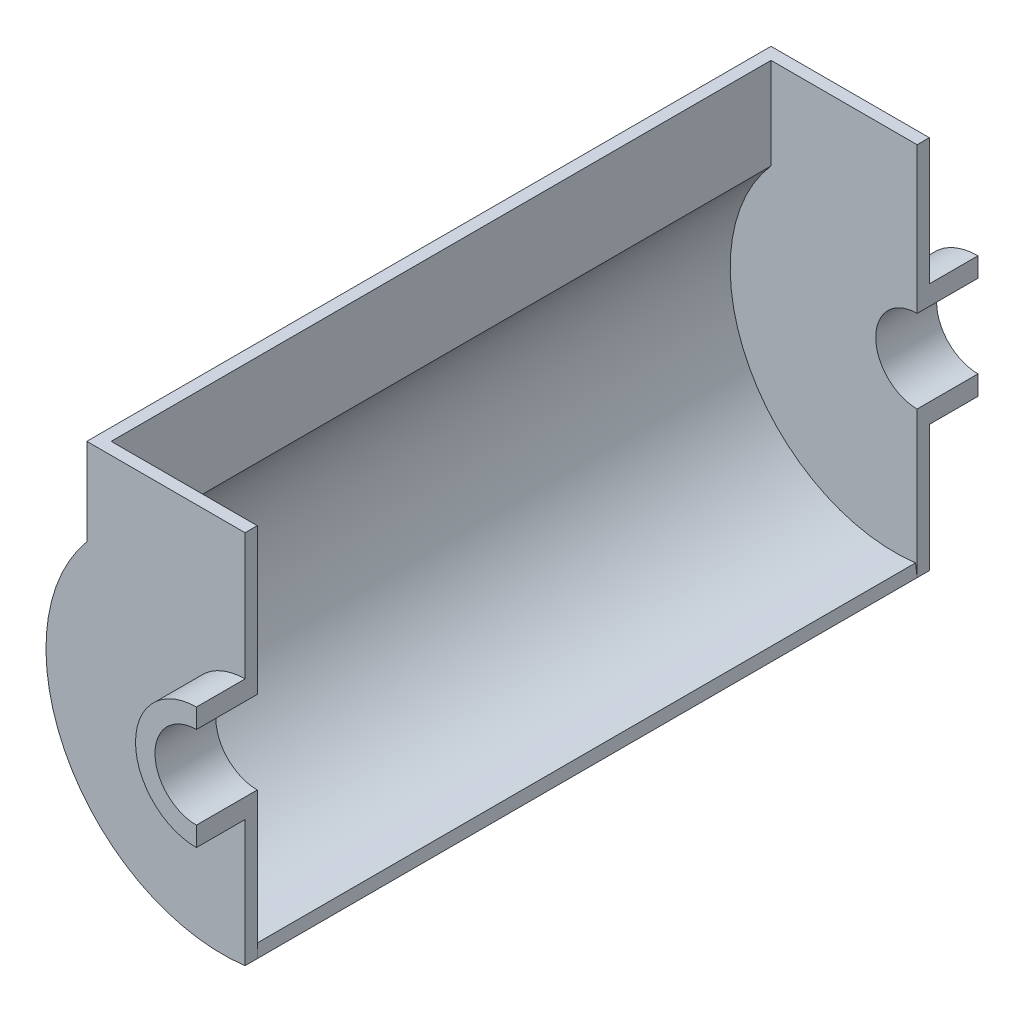
ISO-10303-21;
HEADER;
FILE_DESCRIPTION(('STEP AP214'),'2;1');
FILE_NAME('part.step','',(''),(''),'','','');
FILE_SCHEMA(('AUTOMOTIVE_DESIGN { 1 0 10303 214 1 1 1 1 }'));
ENDSEC;
DATA;
#1=APPLICATION_CONTEXT('core data for automotive mechanical design processes');
#2=APPLICATION_PROTOCOL_DEFINITION('international standard','automotive_design',2000,#1);
#3=PRODUCT_CONTEXT('',#1,'mechanical');
#4=PRODUCT('Part','Part','',(#3));
#5=PRODUCT_RELATED_PRODUCT_CATEGORY('part','',(#4));
#6=PRODUCT_DEFINITION_FORMATION('','',#4);
#7=PRODUCT_DEFINITION_CONTEXT('part definition',#1,'design');
#8=PRODUCT_DEFINITION('design','',#6,#7);
#9=PRODUCT_DEFINITION_SHAPE('','',#8);
#10=(LENGTH_UNIT() NAMED_UNIT(*) SI_UNIT(.MILLI.,.METRE.));
#11=(NAMED_UNIT(*) PLANE_ANGLE_UNIT() SI_UNIT($,.RADIAN.));
#12=(NAMED_UNIT(*) SI_UNIT($,.STERADIAN.) SOLID_ANGLE_UNIT());
#13=UNCERTAINTY_MEASURE_WITH_UNIT(LENGTH_MEASURE(1.E-05),#10,'distance_accuracy_value','');
#14=(GEOMETRIC_REPRESENTATION_CONTEXT(3) GLOBAL_UNCERTAINTY_ASSIGNED_CONTEXT((#13)) GLOBAL_UNIT_ASSIGNED_CONTEXT((#10,
#11,#12)) REPRESENTATION_CONTEXT('',''));
#15=CARTESIAN_POINT('',(0.,0.,0.));
#16=DIRECTION('',(0.,0.,1.));
#17=DIRECTION('',(1.,0.,0.));
#18=AXIS2_PLACEMENT_3D('',#15,#16,#17);
#19=CARTESIAN_POINT('',(0.,0.,-5.));
#20=DIRECTION('',(0.,0.,1.));
#21=DIRECTION('',(1.,0.,0.));
#22=AXIS2_PLACEMENT_3D('',#19,#20,#21);
#23=PLANE('',#22);
#24=DIRECTION('',(0.127888141003739,-0.99178859813501,0.));
#25=VECTOR('',#24,1.);
#26=CARTESIAN_POINT('',(0.,-77.,-5.));
#27=LINE('',#26,#25);
#28=CARTESIAN_POINT('',(-0.639440705018703,-72.0410570093249,-5.));
#29=VERTEX_POINT('',#28);
#30=CARTESIAN_POINT('',(0.,-77.,-5.));
#31=VERTEX_POINT('',#30);
#32=EDGE_CURVE('E61',#29,#31,#27,.T.);
#33=ORIENTED_EDGE('',*,*,#32,.F.);
#34=CARTESIAN_POINT('',(-9.2718902227714,-5.09532663521184,-5.));
#35=DIRECTION('',(0.,0.,1.));
#36=DIRECTION('',(-1.,0.,0.));
#37=AXIS2_PLACEMENT_3D('',#34,#35,#36);
#38=CIRCLE('',#37,67.5);
#39=CARTESIAN_POINT('',(-60.,39.4345383817567,-5.));
#40=VERTEX_POINT('',#39);
#41=EDGE_CURVE('E225',#40,#29,#38,.T.);
#42=ORIENTED_EDGE('',*,*,#41,.F.);
#43=DIRECTION('',(0.,-1.,0.));
#44=VECTOR('',#43,1.);
#45=CARTESIAN_POINT('',(-60.,77.,-5.));
#46=LINE('',#45,#44);
#47=CARTESIAN_POINT('',(-60.,77.,-5.));
#48=VERTEX_POINT('',#47);
#49=EDGE_CURVE('E67',#48,#40,#46,.T.);
#50=ORIENTED_EDGE('',*,*,#49,.F.);
#51=DIRECTION('',(-1.,0.,0.));
#52=VECTOR('',#51,1.);
#53=CARTESIAN_POINT('',(0.,77.,-5.));
#54=LINE('',#53,#52);
#55=CARTESIAN_POINT('',(0.,77.,-5.));
#56=VERTEX_POINT('',#55);
#57=EDGE_CURVE('E252',#56,#48,#54,.T.);
#58=ORIENTED_EDGE('',*,*,#57,.F.);
#59=DIRECTION('',(0.,1.,0.));
#60=VECTOR('',#59,1.);
#61=CARTESIAN_POINT('',(0.,17.,-5.));
#62=LINE('',#61,#60);
#63=CARTESIAN_POINT('',(0.,17.,-5.));
#64=VERTEX_POINT('',#63);
#65=EDGE_CURVE('E310',#64,#56,#62,.T.);
#66=ORIENTED_EDGE('',*,*,#65,.F.);
#67=CARTESIAN_POINT('',(0.,0.,-5.));
#68=DIRECTION('',(0.,0.,-1.));
#69=DIRECTION('',(1.,0.,0.));
#70=AXIS2_PLACEMENT_3D('',#67,#68,#69);
#71=CIRCLE('',#70,17.);
#72=CARTESIAN_POINT('',(0.,-17.,-5.));
#73=VERTEX_POINT('',#72);
#74=EDGE_CURVE('E306',#73,#64,#71,.T.);
#75=ORIENTED_EDGE('',*,*,#74,.F.);
#76=DIRECTION('',(0.,1.,0.));
#77=VECTOR('',#76,1.);
#78=CARTESIAN_POINT('',(0.,-25.,-5.));
#79=LINE('',#78,#77);
#80=EDGE_CURVE('E313',#31,#73,#79,.T.);
#81=ORIENTED_EDGE('',*,*,#80,.F.);
#82=EDGE_LOOP('',(#33,#42,#50,#58,#66,#75,#81));
#83=FACE_BOUND('',#82,.T.);
#84=ADVANCED_FACE('F43',(#83),#23,.F.);
#85=CARTESIAN_POINT('',(0.,0.,-5.));
#86=DIRECTION('',(0.,0.,1.));
#87=DIRECTION('',(1.,0.,0.));
#88=AXIS2_PLACEMENT_3D('',#85,#86,#87);
#89=CYLINDRICAL_SURFACE('',#88,17.);
#90=DIRECTION('',(0.,0.,1.));
#91=VECTOR('',#90,1.);
#92=CARTESIAN_POINT('',(0.,17.,-5.));
#93=LINE('',#92,#91);
#94=CARTESIAN_POINT('',(0.,17.,20.));
#95=VERTEX_POINT('',#94);
#96=EDGE_CURVE('E47',#64,#95,#93,.T.);
#97=ORIENTED_EDGE('',*,*,#96,.T.);
#98=CARTESIAN_POINT('',(0.,0.,20.));
#99=DIRECTION('',(0.,0.,-1.));
#100=DIRECTION('',(1.,0.,0.));
#101=AXIS2_PLACEMENT_3D('',#98,#99,#100);
#102=CIRCLE('',#101,17.);
#103=CARTESIAN_POINT('',(0.,-17.,20.));
#104=VERTEX_POINT('',#103);
#105=EDGE_CURVE('E282',#104,#95,#102,.T.);
#106=ORIENTED_EDGE('',*,*,#105,.F.);
#107=DIRECTION('',(0.,0.,1.));
#108=VECTOR('',#107,1.);
#109=CARTESIAN_POINT('',(0.,-17.,-5.));
#110=LINE('',#109,#108);
#111=EDGE_CURVE('E11',#73,#104,#110,.T.);
#112=ORIENTED_EDGE('',*,*,#111,.F.);
#113=ORIENTED_EDGE('',*,*,#74,.T.);
#114=EDGE_LOOP('',(#97,#106,#112,#113));
#115=FACE_BOUND('',#114,.T.);
#116=ADVANCED_FACE('F45',(#115),#89,.F.);
#117=CARTESIAN_POINT('',(0.,-25.,-5.));
#118=DIRECTION('',(1.,0.,0.));
#119=DIRECTION('',(0.,0.,-1.));
#120=AXIS2_PLACEMENT_3D('',#117,#118,#119);
#121=PLANE('',#120);
#122=ORIENTED_EDGE('',*,*,#111,.T.);
#123=DIRECTION('',(0.,1.,0.));
#124=VECTOR('',#123,1.);
#125=CARTESIAN_POINT('',(0.,-25.,20.));
#126=LINE('',#125,#124);
#127=CARTESIAN_POINT('',(0.,-25.,20.));
#128=VERTEX_POINT('',#127);
#129=EDGE_CURVE('E302',#128,#104,#126,.T.);
#130=ORIENTED_EDGE('',*,*,#129,.F.);
#131=DIRECTION('',(0.,0.,1.));
#132=VECTOR('',#131,1.);
#133=CARTESIAN_POINT('',(0.,-25.,-5.));
#134=LINE('',#133,#132);
#135=CARTESIAN_POINT('',(0.,-25.,0.));
#136=VERTEX_POINT('',#135);
#137=EDGE_CURVE('E53',#136,#128,#134,.T.);
#138=ORIENTED_EDGE('',*,*,#137,.F.);
#139=DIRECTION('',(0.,1.,0.));
#140=VECTOR('',#139,1.);
#141=CARTESIAN_POINT('',(0.,-25.,0.));
#142=LINE('',#141,#140);
#143=CARTESIAN_POINT('',(0.,-77.,0.));
#144=VERTEX_POINT('',#143);
#145=EDGE_CURVE('E256',#144,#136,#142,.T.);
#146=ORIENTED_EDGE('',*,*,#145,.F.);
#147=DIRECTION('',(0.,0.,1.));
#148=VECTOR('',#147,1.);
#149=CARTESIAN_POINT('',(0.,-77.,-5.));
#150=LINE('',#149,#148);
#151=EDGE_CURVE('E279',#31,#144,#150,.T.);
#152=ORIENTED_EDGE('',*,*,#151,.F.);
#153=ORIENTED_EDGE('',*,*,#80,.T.);
#154=EDGE_LOOP('',(#122,#130,#138,#146,#152,#153));
#155=FACE_BOUND('',#154,.T.);
#156=ADVANCED_FACE('F335',(#155),#121,.T.);
#157=CARTESIAN_POINT('',(0.,0.,-5.));
#158=DIRECTION('',(0.,0.,1.));
#159=DIRECTION('',(1.,0.,0.));
#160=AXIS2_PLACEMENT_3D('',#157,#158,#159);
#161=CYLINDRICAL_SURFACE('',#160,25.);
#162=CARTESIAN_POINT('',(0.,0.,0.));
#163=DIRECTION('',(0.,0.,-1.));
#164=DIRECTION('',(1.,0.,0.));
#165=AXIS2_PLACEMENT_3D('',#162,#163,#164);
#166=CIRCLE('',#165,25.);
#167=CARTESIAN_POINT('',(0.,25.,0.));
#168=VERTEX_POINT('',#167);
#169=EDGE_CURVE('E235',#136,#168,#166,.T.);
#170=ORIENTED_EDGE('',*,*,#169,.F.);
#171=ORIENTED_EDGE('',*,*,#137,.T.);
#172=CARTESIAN_POINT('',(0.,0.,20.));
#173=DIRECTION('',(0.,0.,1.));
#174=DIRECTION('',(1.,0.,0.));
#175=AXIS2_PLACEMENT_3D('',#172,#173,#174);
#176=CIRCLE('',#175,25.);
#177=CARTESIAN_POINT('',(0.,25.,20.));
#178=VERTEX_POINT('',#177);
#179=EDGE_CURVE('E298',#178,#128,#176,.T.);
#180=ORIENTED_EDGE('',*,*,#179,.F.);
#181=DIRECTION('',(0.,0.,1.));
#182=VECTOR('',#181,1.);
#183=CARTESIAN_POINT('',(0.,25.,-5.));
#184=LINE('',#183,#182);
#185=EDGE_CURVE('E318',#168,#178,#184,.T.);
#186=ORIENTED_EDGE('',*,*,#185,.F.);
#187=EDGE_LOOP('',(#170,#171,#180,#186));
#188=FACE_BOUND('',#187,.T.);
#189=ADVANCED_FACE('F343',(#188),#161,.T.);
#190=CARTESIAN_POINT('',(0.,17.,-5.));
#191=DIRECTION('',(1.,0.,0.));
#192=DIRECTION('',(0.,0.,-1.));
#193=AXIS2_PLACEMENT_3D('',#190,#191,#192);
#194=PLANE('',#193);
#195=ORIENTED_EDGE('',*,*,#65,.T.);
#196=DIRECTION('',(0.,0.,1.));
#197=VECTOR('',#196,1.);
#198=CARTESIAN_POINT('',(0.,77.,-5.));
#199=LINE('',#198,#197);
#200=CARTESIAN_POINT('',(0.,77.,0.));
#201=VERTEX_POINT('',#200);
#202=EDGE_CURVE('E255',#56,#201,#199,.T.);
#203=ORIENTED_EDGE('',*,*,#202,.T.);
#204=DIRECTION('',(0.,1.,0.));
#205=VECTOR('',#204,1.);
#206=CARTESIAN_POINT('',(0.,25.,0.));
#207=LINE('',#206,#205);
#208=EDGE_CURVE('E260',#168,#201,#207,.T.);
#209=ORIENTED_EDGE('',*,*,#208,.F.);
#210=ORIENTED_EDGE('',*,*,#185,.T.);
#211=DIRECTION('',(0.,1.,0.));
#212=VECTOR('',#211,1.);
#213=CARTESIAN_POINT('',(0.,17.,20.));
#214=LINE('',#213,#212);
#215=EDGE_CURVE('E294',#95,#178,#214,.T.);
#216=ORIENTED_EDGE('',*,*,#215,.F.);
#217=ORIENTED_EDGE('',*,*,#96,.F.);
#218=EDGE_LOOP('',(#195,#203,#209,#210,#216,#217));
#219=FACE_BOUND('',#218,.T.);
#220=ADVANCED_FACE('F328',(#219),#194,.T.);
#221=CARTESIAN_POINT('',(0.,0.,20.));
#222=DIRECTION('',(0.,0.,1.));
#223=DIRECTION('',(1.,0.,0.));
#224=AXIS2_PLACEMENT_3D('',#221,#222,#223);
#225=PLANE('',#224);
#226=ORIENTED_EDGE('',*,*,#105,.T.);
#227=ORIENTED_EDGE('',*,*,#215,.T.);
#228=ORIENTED_EDGE('',*,*,#179,.T.);
#229=ORIENTED_EDGE('',*,*,#129,.T.);
#230=EDGE_LOOP('',(#226,#227,#228,#229));
#231=FACE_BOUND('',#230,.T.);
#232=ADVANCED_FACE('F331',(#231),#225,.T.);
#233=CARTESIAN_POINT('',(-9.2718902227714,-5.09532663521184,-5.));
#234=DIRECTION('',(0.,0.,1.));
#235=DIRECTION('',(1.,0.,0.));
#236=AXIS2_PLACEMENT_3D('',#233,#234,#235);
#237=CYLINDRICAL_SURFACE('',#236,72.5);
#238=CARTESIAN_POINT('',(-9.2718902227714,-5.09532663521184,0.));
#239=DIRECTION('',(0.,0.,1.));
#240=DIRECTION('',(1.,0.,0.));
#241=AXIS2_PLACEMENT_3D('',#238,#239,#240);
#242=CIRCLE('',#241,72.5);
#243=CARTESIAN_POINT('',(-65.,41.2795348811006,0.));
#244=VERTEX_POINT('',#243);
#245=EDGE_CURVE('E272',#244,#144,#242,.T.);
#246=ORIENTED_EDGE('',*,*,#245,.F.);
#247=DIRECTION('',(0.,0.,1.));
#248=VECTOR('',#247,1.);
#249=CARTESIAN_POINT('',(-65.,41.2795348811006,-5.));
#250=LINE('',#249,#248);
#251=CARTESIAN_POINT('',(-65.,41.2795348811006,-281.));
#252=VERTEX_POINT('',#251);
#253=EDGE_CURVE('E283',#252,#244,#250,.T.);
#254=ORIENTED_EDGE('',*,*,#253,.F.);
#255=CARTESIAN_POINT('',(-9.2718902227714,-5.09532663521184,-281.));
#256=DIRECTION('',(0.,0.,1.));
#257=DIRECTION('',(1.,0.,0.));
#258=AXIS2_PLACEMENT_3D('',#255,#256,#257);
#259=CIRCLE('',#258,72.5);
#260=CARTESIAN_POINT('',(0.,-77.,-281.));
#261=VERTEX_POINT('',#260);
#262=EDGE_CURVE('E424',#252,#261,#259,.T.);
#263=ORIENTED_EDGE('',*,*,#262,.T.);
#264=DIRECTION('',(0.,0.,-1.));
#265=VECTOR('',#264,1.);
#266=CARTESIAN_POINT('',(0.,-77.,-276.));
#267=LINE('',#266,#265);
#268=CARTESIAN_POINT('',(0.,-77.,-276.));
#269=VERTEX_POINT('',#268);
#270=EDGE_CURVE('E188',#269,#261,#267,.T.);
#271=ORIENTED_EDGE('',*,*,#270,.F.);
#272=DIRECTION('',(0.,0.,1.));
#273=VECTOR('',#272,1.);
#274=CARTESIAN_POINT('',(0.,-77.,-450.889556715239));
#275=LINE('',#274,#273);
#276=EDGE_CURVE('E210',#269,#31,#275,.T.);
#277=ORIENTED_EDGE('',*,*,#276,.T.);
#278=ORIENTED_EDGE('',*,*,#151,.T.);
#279=EDGE_LOOP('',(#246,#254,#263,#271,#277,#278));
#280=FACE_BOUND('',#279,.T.);
#281=ADVANCED_FACE('F359',(#280),#237,.T.);
#282=CARTESIAN_POINT('',(-65.,77.,-5.));
#283=DIRECTION('',(-1.,0.,0.));
#284=DIRECTION('',(0.,-1.,0.));
#285=AXIS2_PLACEMENT_3D('',#282,#283,#284);
#286=PLANE('',#285);
#287=DIRECTION('',(0.,-1.,0.));
#288=VECTOR('',#287,1.);
#289=CARTESIAN_POINT('',(-65.,77.,0.));
#290=LINE('',#289,#288);
#291=CARTESIAN_POINT('',(-65.,77.,0.));
#292=VERTEX_POINT('',#291);
#293=EDGE_CURVE('E268',#292,#244,#290,.T.);
#294=ORIENTED_EDGE('',*,*,#293,.F.);
#295=DIRECTION('',(0.,0.,1.));
#296=VECTOR('',#295,1.);
#297=CARTESIAN_POINT('',(-65.,77.,-5.));
#298=LINE('',#297,#296);
#299=CARTESIAN_POINT('',(-65.,77.,-281.));
#300=VERTEX_POINT('',#299);
#301=EDGE_CURVE('E286',#300,#292,#298,.T.);
#302=ORIENTED_EDGE('',*,*,#301,.F.);
#303=DIRECTION('',(0.,-1.,0.));
#304=VECTOR('',#303,1.);
#305=CARTESIAN_POINT('',(-65.,77.,-281.));
#306=LINE('',#305,#304);
#307=EDGE_CURVE('E427',#300,#252,#306,.T.);
#308=ORIENTED_EDGE('',*,*,#307,.T.);
#309=ORIENTED_EDGE('',*,*,#253,.T.);
#310=EDGE_LOOP('',(#294,#302,#308,#309));
#311=FACE_BOUND('',#310,.T.);
#312=ADVANCED_FACE('F362',(#311),#286,.T.);
#313=CARTESIAN_POINT('',(0.,77.,-5.));
#314=DIRECTION('',(0.,1.,0.));
#315=DIRECTION('',(-1.,0.,0.));
#316=AXIS2_PLACEMENT_3D('',#313,#314,#315);
#317=PLANE('',#316);
#318=DIRECTION('',(-1.,0.,0.));
#319=VECTOR('',#318,1.);
#320=CARTESIAN_POINT('',(0.,77.,0.));
#321=LINE('',#320,#319);
#322=EDGE_CURVE('E264',#201,#292,#321,.T.);
#323=ORIENTED_EDGE('',*,*,#322,.F.);
#324=ORIENTED_EDGE('',*,*,#202,.F.);
#325=ORIENTED_EDGE('',*,*,#57,.T.);
#326=DIRECTION('',(0.,0.,1.));
#327=VECTOR('',#326,1.);
#328=CARTESIAN_POINT('',(-60.,77.,-450.889556715239));
#329=LINE('',#328,#327);
#330=CARTESIAN_POINT('',(-60.,77.,-276.));
#331=VERTEX_POINT('',#330);
#332=EDGE_CURVE('E173',#331,#48,#329,.T.);
#333=ORIENTED_EDGE('',*,*,#332,.F.);
#334=DIRECTION('',(-1.,0.,0.));
#335=VECTOR('',#334,1.);
#336=CARTESIAN_POINT('',(0.,77.,-276.));
#337=LINE('',#336,#335);
#338=CARTESIAN_POINT('',(0.,77.,-276.));
#339=VERTEX_POINT('',#338);
#340=EDGE_CURVE('E165',#339,#331,#337,.T.);
#341=ORIENTED_EDGE('',*,*,#340,.F.);
#342=DIRECTION('',(0.,0.,-1.));
#343=VECTOR('',#342,1.);
#344=CARTESIAN_POINT('',(0.,77.,-276.));
#345=LINE('',#344,#343);
#346=CARTESIAN_POINT('',(0.,77.,-281.));
#347=VERTEX_POINT('',#346);
#348=EDGE_CURVE('E170',#339,#347,#345,.T.);
#349=ORIENTED_EDGE('',*,*,#348,.T.);
#350=DIRECTION('',(-1.,0.,0.));
#351=VECTOR('',#350,1.);
#352=CARTESIAN_POINT('',(0.,77.,-281.));
#353=LINE('',#352,#351);
#354=EDGE_CURVE('E447',#347,#300,#353,.T.);
#355=ORIENTED_EDGE('',*,*,#354,.T.);
#356=ORIENTED_EDGE('',*,*,#301,.T.);
#357=EDGE_LOOP('',(#323,#324,#325,#333,#341,#349,#355,#356));
#358=FACE_BOUND('',#357,.T.);
#359=ADVANCED_FACE('F168',(#358),#317,.T.);
#360=CARTESIAN_POINT('',(0.,0.,0.));
#361=DIRECTION('',(0.,0.,1.));
#362=DIRECTION('',(1.,0.,0.));
#363=AXIS2_PLACEMENT_3D('',#360,#361,#362);
#364=PLANE('',#363);
#365=ORIENTED_EDGE('',*,*,#169,.T.);
#366=ORIENTED_EDGE('',*,*,#208,.T.);
#367=ORIENTED_EDGE('',*,*,#322,.T.);
#368=ORIENTED_EDGE('',*,*,#293,.T.);
#369=ORIENTED_EDGE('',*,*,#245,.T.);
#370=ORIENTED_EDGE('',*,*,#145,.T.);
#371=EDGE_LOOP('',(#365,#366,#367,#368,#369,#370));
#372=FACE_BOUND('',#371,.T.);
#373=ADVANCED_FACE('F341',(#372),#364,.T.);
#374=CARTESIAN_POINT('',(-60.,77.,-450.889556715239));
#375=DIRECTION('',(-1.,0.,0.));
#376=DIRECTION('',(0.,-1.,0.));
#377=AXIS2_PLACEMENT_3D('',#374,#375,#376);
#378=PLANE('',#377);
#379=DIRECTION('',(0.,-1.,0.));
#380=VECTOR('',#379,1.);
#381=CARTESIAN_POINT('',(-60.,77.,-276.));
#382=LINE('',#381,#380);
#383=CARTESIAN_POINT('',(-60.,39.4345383817567,-276.));
#384=VERTEX_POINT('',#383);
#385=EDGE_CURVE('E236',#331,#384,#382,.T.);
#386=ORIENTED_EDGE('',*,*,#385,.F.);
#387=ORIENTED_EDGE('',*,*,#332,.T.);
#388=ORIENTED_EDGE('',*,*,#49,.T.);
#389=DIRECTION('',(0.,0.,1.));
#390=VECTOR('',#389,1.);
#391=CARTESIAN_POINT('',(-60.,39.4345383817567,-450.889556715239));
#392=LINE('',#391,#390);
#393=EDGE_CURVE('E229',#384,#40,#392,.T.);
#394=ORIENTED_EDGE('',*,*,#393,.F.);
#395=EDGE_LOOP('',(#386,#387,#388,#394));
#396=FACE_BOUND('',#395,.T.);
#397=ADVANCED_FACE('F371',(#396),#378,.F.);
#398=CARTESIAN_POINT('',(-9.2718902227714,-5.09532663521184,-450.889556715239));
#399=DIRECTION('',(0.,0.,1.));
#400=DIRECTION('',(1.,0.,0.));
#401=AXIS2_PLACEMENT_3D('',#398,#399,#400);
#402=CYLINDRICAL_SURFACE('',#401,67.5);
#403=CARTESIAN_POINT('',(-9.2718902227714,-5.09532663521184,-276.));
#404=DIRECTION('',(0.,0.,-1.));
#405=DIRECTION('',(-1.,0.,0.));
#406=AXIS2_PLACEMENT_3D('',#403,#404,#405);
#407=CIRCLE('',#406,67.5);
#408=CARTESIAN_POINT('',(-0.639440705018703,-72.0410570093249,-276.));
#409=VERTEX_POINT('',#408);
#410=EDGE_CURVE('E232',#384,#409,#407,.F.);
#411=ORIENTED_EDGE('',*,*,#410,.F.);
#412=ORIENTED_EDGE('',*,*,#393,.T.);
#413=ORIENTED_EDGE('',*,*,#41,.T.);
#414=DIRECTION('',(0.,0.,1.));
#415=VECTOR('',#414,1.);
#416=CARTESIAN_POINT('',(-0.639440705018703,-72.0410570093249,-450.889556715239));
#417=LINE('',#416,#415);
#418=EDGE_CURVE('E224',#409,#29,#417,.T.);
#419=ORIENTED_EDGE('',*,*,#418,.F.);
#420=EDGE_LOOP('',(#411,#412,#413,#419));
#421=FACE_BOUND('',#420,.T.);
#422=ADVANCED_FACE('F374',(#421),#402,.F.);
#423=CARTESIAN_POINT('',(0.,-77.,-450.889556715239));
#424=DIRECTION('',(-0.99178859813501,-0.127888141003739,0.));
#425=DIRECTION('',(0.127888141003739,-0.99178859813501,0.));
#426=AXIS2_PLACEMENT_3D('',#423,#424,#425);
#427=PLANE('',#426);
#428=DIRECTION('',(0.127888141003739,-0.99178859813501,0.));
#429=VECTOR('',#428,1.);
#430=CARTESIAN_POINT('',(0.,-77.,-276.));
#431=LINE('',#430,#429);
#432=EDGE_CURVE('E223',#409,#269,#431,.T.);
#433=ORIENTED_EDGE('',*,*,#432,.F.);
#434=ORIENTED_EDGE('',*,*,#418,.T.);
#435=ORIENTED_EDGE('',*,*,#32,.T.);
#436=ORIENTED_EDGE('',*,*,#276,.F.);
#437=EDGE_LOOP('',(#433,#434,#435,#436));
#438=FACE_BOUND('',#437,.T.);
#439=ADVANCED_FACE('F378',(#438),#427,.F.);
#440=CARTESIAN_POINT('',(0.,0.,-276.));
#441=DIRECTION('',(0.,0.,-1.));
#442=DIRECTION('',(1.,0.,0.));
#443=AXIS2_PLACEMENT_3D('',#440,#441,#442);
#444=PLANE('',#443);
#445=ORIENTED_EDGE('',*,*,#410,.T.);
#446=ORIENTED_EDGE('',*,*,#432,.T.);
#447=DIRECTION('',(0.,1.,0.));
#448=VECTOR('',#447,1.);
#449=CARTESIAN_POINT('',(0.,-25.,-276.));
#450=LINE('',#449,#448);
#451=CARTESIAN_POINT('',(0.,-17.,-276.));
#452=VERTEX_POINT('',#451);
#453=EDGE_CURVE('E196',#269,#452,#450,.T.);
#454=ORIENTED_EDGE('',*,*,#453,.T.);
#455=CARTESIAN_POINT('',(0.,0.,-276.));
#456=DIRECTION('',(0.,0.,-1.));
#457=DIRECTION('',(1.,0.,0.));
#458=AXIS2_PLACEMENT_3D('',#455,#456,#457);
#459=CIRCLE('',#458,17.);
#460=CARTESIAN_POINT('',(0.,17.,-276.));
#461=VERTEX_POINT('',#460);
#462=EDGE_CURVE('E193',#452,#461,#459,.T.);
#463=ORIENTED_EDGE('',*,*,#462,.T.);
#464=DIRECTION('',(0.,1.,0.));
#465=VECTOR('',#464,1.);
#466=CARTESIAN_POINT('',(0.,17.,-276.));
#467=LINE('',#466,#465);
#468=EDGE_CURVE('E183',#461,#339,#467,.T.);
#469=ORIENTED_EDGE('',*,*,#468,.T.);
#470=ORIENTED_EDGE('',*,*,#340,.T.);
#471=ORIENTED_EDGE('',*,*,#385,.T.);
#472=EDGE_LOOP('',(#445,#446,#454,#463,#469,#470,#471));
#473=FACE_BOUND('',#472,.T.);
#474=ADVANCED_FACE('F191',(#473),#444,.F.);
#475=CARTESIAN_POINT('',(0.,0.,-276.));
#476=DIRECTION('',(0.,0.,-1.));
#477=DIRECTION('',(1.,0.,0.));
#478=AXIS2_PLACEMENT_3D('',#475,#476,#477);
#479=CYLINDRICAL_SURFACE('',#478,17.);
#480=DIRECTION('',(0.,0.,-1.));
#481=VECTOR('',#480,1.);
#482=CARTESIAN_POINT('',(0.,17.,-276.));
#483=LINE('',#482,#481);
#484=CARTESIAN_POINT('',(0.,17.,-301.));
#485=VERTEX_POINT('',#484);
#486=EDGE_CURVE('E200',#461,#485,#483,.T.);
#487=ORIENTED_EDGE('',*,*,#486,.F.);
#488=ORIENTED_EDGE('',*,*,#462,.F.);
#489=DIRECTION('',(0.,0.,-1.));
#490=VECTOR('',#489,1.);
#491=CARTESIAN_POINT('',(0.,-17.,-276.));
#492=LINE('',#491,#490);
#493=CARTESIAN_POINT('',(0.,-17.,-301.));
#494=VERTEX_POINT('',#493);
#495=EDGE_CURVE('E206',#452,#494,#492,.T.);
#496=ORIENTED_EDGE('',*,*,#495,.T.);
#497=CARTESIAN_POINT('',(0.,0.,-301.));
#498=DIRECTION('',(0.,0.,-1.));
#499=DIRECTION('',(1.,0.,0.));
#500=AXIS2_PLACEMENT_3D('',#497,#498,#499);
#501=CIRCLE('',#500,17.);
#502=EDGE_CURVE('E432',#494,#485,#501,.T.);
#503=ORIENTED_EDGE('',*,*,#502,.T.);
#504=EDGE_LOOP('',(#487,#488,#496,#503));
#505=FACE_BOUND('',#504,.T.);
#506=ADVANCED_FACE('F383',(#505),#479,.F.);
#507=CARTESIAN_POINT('',(0.,-25.,-276.));
#508=DIRECTION('',(1.,0.,0.));
#509=DIRECTION('',(0.,0.,1.));
#510=AXIS2_PLACEMENT_3D('',#507,#508,#509);
#511=PLANE('',#510);
#512=ORIENTED_EDGE('',*,*,#495,.F.);
#513=ORIENTED_EDGE('',*,*,#453,.F.);
#514=ORIENTED_EDGE('',*,*,#270,.T.);
#515=DIRECTION('',(0.,1.,0.));
#516=VECTOR('',#515,1.);
#517=CARTESIAN_POINT('',(0.,-25.,-281.));
#518=LINE('',#517,#516);
#519=CARTESIAN_POINT('',(0.,-25.,-281.));
#520=VERTEX_POINT('',#519);
#521=EDGE_CURVE('E178',#261,#520,#518,.T.);
#522=ORIENTED_EDGE('',*,*,#521,.T.);
#523=DIRECTION('',(0.,0.,-1.));
#524=VECTOR('',#523,1.);
#525=CARTESIAN_POINT('',(0.,-25.,-276.));
#526=LINE('',#525,#524);
#527=CARTESIAN_POINT('',(0.,-25.,-301.));
#528=VERTEX_POINT('',#527);
#529=EDGE_CURVE('E211',#520,#528,#526,.T.);
#530=ORIENTED_EDGE('',*,*,#529,.T.);
#531=DIRECTION('',(0.,1.,0.));
#532=VECTOR('',#531,1.);
#533=CARTESIAN_POINT('',(0.,-25.,-301.));
#534=LINE('',#533,#532);
#535=EDGE_CURVE('E202',#528,#494,#534,.T.);
#536=ORIENTED_EDGE('',*,*,#535,.T.);
#537=EDGE_LOOP('',(#512,#513,#514,#522,#530,#536));
#538=FACE_BOUND('',#537,.T.);
#539=ADVANCED_FACE('F386',(#538),#511,.T.);
#540=CARTESIAN_POINT('',(0.,0.,-276.));
#541=DIRECTION('',(0.,0.,-1.));
#542=DIRECTION('',(1.,0.,0.));
#543=AXIS2_PLACEMENT_3D('',#540,#541,#542);
#544=CYLINDRICAL_SURFACE('',#543,25.);
#545=CARTESIAN_POINT('',(0.,0.,-281.));
#546=DIRECTION('',(0.,0.,-1.));
#547=DIRECTION('',(1.,0.,0.));
#548=AXIS2_PLACEMENT_3D('',#545,#546,#547);
#549=CIRCLE('',#548,25.);
#550=CARTESIAN_POINT('',(0.,25.,-281.));
#551=VERTEX_POINT('',#550);
#552=EDGE_CURVE('E410',#520,#551,#549,.T.);
#553=ORIENTED_EDGE('',*,*,#552,.T.);
#554=DIRECTION('',(0.,0.,-1.));
#555=VECTOR('',#554,1.);
#556=CARTESIAN_POINT('',(0.,25.,-276.));
#557=LINE('',#556,#555);
#558=CARTESIAN_POINT('',(0.,25.,-301.));
#559=VERTEX_POINT('',#558);
#560=EDGE_CURVE('E215',#551,#559,#557,.T.);
#561=ORIENTED_EDGE('',*,*,#560,.T.);
#562=CARTESIAN_POINT('',(0.,0.,-301.));
#563=DIRECTION('',(0.,0.,1.));
#564=DIRECTION('',(1.,0.,0.));
#565=AXIS2_PLACEMENT_3D('',#562,#563,#564);
#566=CIRCLE('',#565,25.);
#567=EDGE_CURVE('E418',#559,#528,#566,.T.);
#568=ORIENTED_EDGE('',*,*,#567,.T.);
#569=ORIENTED_EDGE('',*,*,#529,.F.);
#570=EDGE_LOOP('',(#553,#561,#568,#569));
#571=FACE_BOUND('',#570,.T.);
#572=ADVANCED_FACE('F391',(#571),#544,.T.);
#573=CARTESIAN_POINT('',(0.,17.,-276.));
#574=DIRECTION('',(1.,0.,0.));
#575=DIRECTION('',(0.,0.,1.));
#576=AXIS2_PLACEMENT_3D('',#573,#574,#575);
#577=PLANE('',#576);
#578=ORIENTED_EDGE('',*,*,#468,.F.);
#579=ORIENTED_EDGE('',*,*,#486,.T.);
#580=DIRECTION('',(0.,1.,0.));
#581=VECTOR('',#580,1.);
#582=CARTESIAN_POINT('',(0.,17.,-301.));
#583=LINE('',#582,#581);
#584=EDGE_CURVE('E437',#485,#559,#583,.T.);
#585=ORIENTED_EDGE('',*,*,#584,.T.);
#586=ORIENTED_EDGE('',*,*,#560,.F.);
#587=DIRECTION('',(0.,1.,0.));
#588=VECTOR('',#587,1.);
#589=CARTESIAN_POINT('',(0.,25.,-281.));
#590=LINE('',#589,#588);
#591=EDGE_CURVE('E186',#551,#347,#590,.T.);
#592=ORIENTED_EDGE('',*,*,#591,.T.);
#593=ORIENTED_EDGE('',*,*,#348,.F.);
#594=EDGE_LOOP('',(#578,#579,#585,#586,#592,#593));
#595=FACE_BOUND('',#594,.T.);
#596=ADVANCED_FACE('F181',(#595),#577,.T.);
#597=CARTESIAN_POINT('',(0.,0.,-301.));
#598=DIRECTION('',(0.,0.,-1.));
#599=DIRECTION('',(1.,0.,0.));
#600=AXIS2_PLACEMENT_3D('',#597,#598,#599);
#601=PLANE('',#600);
#602=ORIENTED_EDGE('',*,*,#502,.F.);
#603=ORIENTED_EDGE('',*,*,#535,.F.);
#604=ORIENTED_EDGE('',*,*,#567,.F.);
#605=ORIENTED_EDGE('',*,*,#584,.F.);
#606=EDGE_LOOP('',(#602,#603,#604,#605));
#607=FACE_BOUND('',#606,.T.);
#608=ADVANCED_FACE('F390',(#607),#601,.T.);
#609=CARTESIAN_POINT('',(0.,0.,-281.));
#610=DIRECTION('',(0.,0.,-1.));
#611=DIRECTION('',(1.,0.,0.));
#612=AXIS2_PLACEMENT_3D('',#609,#610,#611);
#613=PLANE('',#612);
#614=ORIENTED_EDGE('',*,*,#552,.F.);
#615=ORIENTED_EDGE('',*,*,#521,.F.);
#616=ORIENTED_EDGE('',*,*,#262,.F.);
#617=ORIENTED_EDGE('',*,*,#307,.F.);
#618=ORIENTED_EDGE('',*,*,#354,.F.);
#619=ORIENTED_EDGE('',*,*,#591,.F.);
#620=EDGE_LOOP('',(#614,#615,#616,#617,#618,#619));
#621=FACE_BOUND('',#620,.T.);
#622=ADVANCED_FACE('F402',(#621),#613,.T.);
#623=CLOSED_SHELL('',(#84,#116,#156,#189,#220,#232,#281,#312,#359,#373,#397,#422,#439,#474,#506,
#539,#572,#596,#608,#622));
#624=MANIFOLD_SOLID_BREP('B2',#623);
#625=ADVANCED_BREP_SHAPE_REPRESENTATION('',(#18,#624),#14);
#626=SHAPE_DEFINITION_REPRESENTATION(#9,#625);
ENDSEC;
END-ISO-10303-21;
